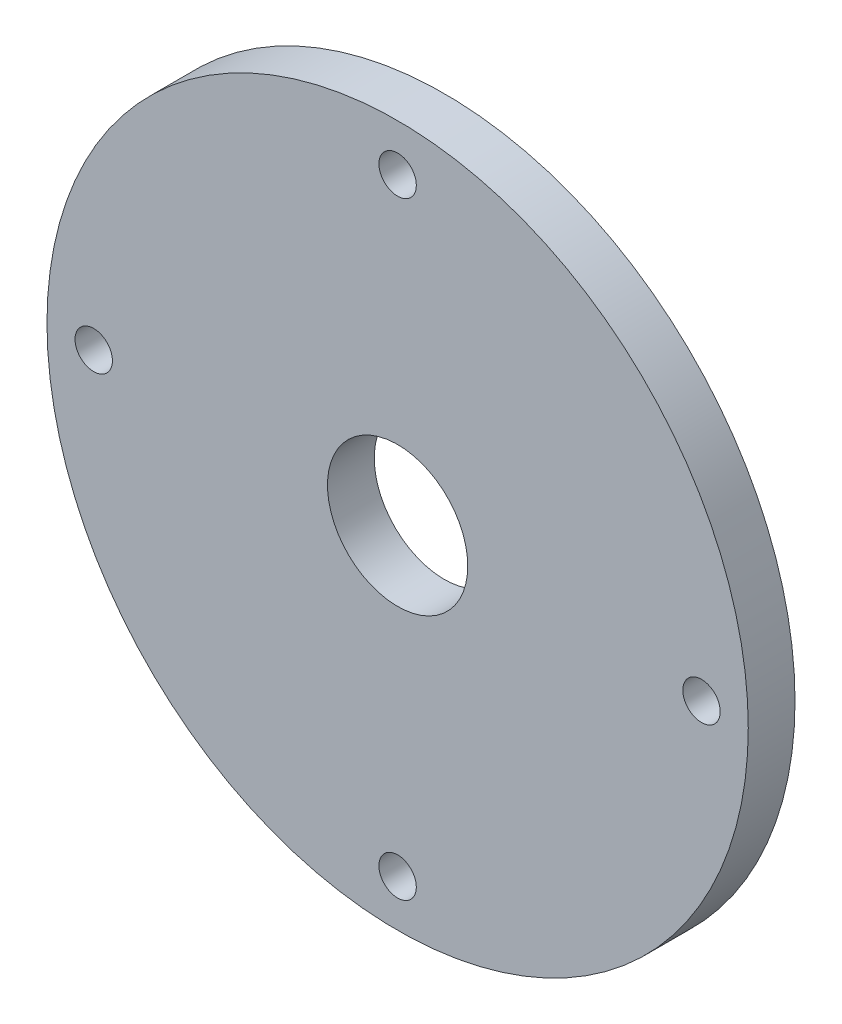
ISO-10303-21;
HEADER;
FILE_DESCRIPTION(('STEP AP214'),'2;1');
FILE_NAME('part.step','',(''),(''),'','','');
FILE_SCHEMA(('AUTOMOTIVE_DESIGN { 1 0 10303 214 1 1 1 1 }'));
ENDSEC;
DATA;
#1=APPLICATION_CONTEXT('core data for automotive mechanical design processes');
#2=APPLICATION_PROTOCOL_DEFINITION('international standard','automotive_design',2000,#1);
#3=PRODUCT_CONTEXT('',#1,'mechanical');
#4=PRODUCT('Part','Part','',(#3));
#5=PRODUCT_RELATED_PRODUCT_CATEGORY('part','',(#4));
#6=PRODUCT_DEFINITION_FORMATION('','',#4);
#7=PRODUCT_DEFINITION_CONTEXT('part definition',#1,'design');
#8=PRODUCT_DEFINITION('design','',#6,#7);
#9=PRODUCT_DEFINITION_SHAPE('','',#8);
#10=(LENGTH_UNIT() NAMED_UNIT(*) SI_UNIT(.MILLI.,.METRE.));
#11=(NAMED_UNIT(*) PLANE_ANGLE_UNIT() SI_UNIT($,.RADIAN.));
#12=(NAMED_UNIT(*) SI_UNIT($,.STERADIAN.) SOLID_ANGLE_UNIT());
#13=UNCERTAINTY_MEASURE_WITH_UNIT(LENGTH_MEASURE(1.E-05),#10,'distance_accuracy_value','');
#14=(GEOMETRIC_REPRESENTATION_CONTEXT(3) GLOBAL_UNCERTAINTY_ASSIGNED_CONTEXT((#13)) GLOBAL_UNIT_ASSIGNED_CONTEXT((#10,
#11,#12)) REPRESENTATION_CONTEXT('',''));
#15=CARTESIAN_POINT('',(0.,0.,0.));
#16=DIRECTION('',(0.,0.,1.));
#17=DIRECTION('',(1.,0.,0.));
#18=AXIS2_PLACEMENT_3D('',#15,#16,#17);
#19=CARTESIAN_POINT('',(0.,0.,10.));
#20=DIRECTION('',(0.,0.,1.));
#21=DIRECTION('',(1.,0.,0.));
#22=AXIS2_PLACEMENT_3D('',#19,#20,#21);
#23=PLANE('',#22);
#24=CARTESIAN_POINT('',(0.,-65.,10.));
#25=DIRECTION('',(0.,0.,1.));
#26=DIRECTION('',(1.,0.,0.));
#27=AXIS2_PLACEMENT_3D('',#24,#25,#26);
#28=CIRCLE('',#27,4.);
#29=CARTESIAN_POINT('',(4.,-65.,10.));
#30=VERTEX_POINT('',#29);
#31=EDGE_CURVE('E59',#30,#30,#28,.T.);
#32=ORIENTED_EDGE('',*,*,#31,.F.);
#33=EDGE_LOOP('',(#32));
#34=FACE_BOUND('',#33,.T.);
#35=CARTESIAN_POINT('',(0.,65.,10.));
#36=DIRECTION('',(0.,0.,1.));
#37=DIRECTION('',(1.,0.,0.));
#38=AXIS2_PLACEMENT_3D('',#35,#36,#37);
#39=CIRCLE('',#38,4.);
#40=CARTESIAN_POINT('',(4.,65.,10.));
#41=VERTEX_POINT('',#40);
#42=EDGE_CURVE('E47',#41,#41,#39,.T.);
#43=ORIENTED_EDGE('',*,*,#42,.F.);
#44=EDGE_LOOP('',(#43));
#45=FACE_BOUND('',#44,.T.);
#46=CARTESIAN_POINT('',(0.,0.,10.));
#47=DIRECTION('',(0.,0.,1.));
#48=DIRECTION('',(1.,0.,0.));
#49=AXIS2_PLACEMENT_3D('',#46,#47,#48);
#50=CIRCLE('',#49,75.);
#51=CARTESIAN_POINT('',(75.,0.,10.));
#52=VERTEX_POINT('',#51);
#53=EDGE_CURVE('E10',#52,#52,#50,.T.);
#54=ORIENTED_EDGE('',*,*,#53,.T.);
#55=EDGE_LOOP('',(#54));
#56=FACE_BOUND('',#55,.T.);
#57=CARTESIAN_POINT('',(0.,0.,10.));
#58=DIRECTION('',(0.,0.,1.));
#59=DIRECTION('',(1.,0.,0.));
#60=AXIS2_PLACEMENT_3D('',#57,#58,#59);
#61=CIRCLE('',#60,15.);
#62=CARTESIAN_POINT('',(15.,0.,10.));
#63=VERTEX_POINT('',#62);
#64=EDGE_CURVE('E42',#63,#63,#61,.T.);
#65=ORIENTED_EDGE('',*,*,#64,.F.);
#66=EDGE_LOOP('',(#65));
#67=FACE_BOUND('',#66,.T.);
#68=CARTESIAN_POINT('',(-65.,0.,10.));
#69=DIRECTION('',(0.,0.,1.));
#70=DIRECTION('',(1.,0.,0.));
#71=AXIS2_PLACEMENT_3D('',#68,#69,#70);
#72=CIRCLE('',#71,4.00000000000001);
#73=CARTESIAN_POINT('',(-61.,0.,10.));
#74=VERTEX_POINT('',#73);
#75=EDGE_CURVE('E53',#74,#74,#72,.T.);
#76=ORIENTED_EDGE('',*,*,#75,.F.);
#77=EDGE_LOOP('',(#76));
#78=FACE_BOUND('',#77,.T.);
#79=CARTESIAN_POINT('',(65.,0.,10.));
#80=DIRECTION('',(0.,0.,1.));
#81=DIRECTION('',(1.,0.,0.));
#82=AXIS2_PLACEMENT_3D('',#79,#80,#81);
#83=CIRCLE('',#82,4.00000000000001);
#84=CARTESIAN_POINT('',(69.,0.,10.));
#85=VERTEX_POINT('',#84);
#86=EDGE_CURVE('E65',#85,#85,#83,.T.);
#87=ORIENTED_EDGE('',*,*,#86,.F.);
#88=EDGE_LOOP('',(#87));
#89=FACE_BOUND('',#88,.T.);
#90=ADVANCED_FACE('F31',(#34,#45,#56,#67,#78,#89),#23,.T.);
#91=CARTESIAN_POINT('',(0.,0.,0.));
#92=DIRECTION('',(0.,0.,1.));
#93=DIRECTION('',(1.,0.,0.));
#94=AXIS2_PLACEMENT_3D('',#91,#92,#93);
#95=PLANE('',#94);
#96=CARTESIAN_POINT('',(0.,0.,0.));
#97=DIRECTION('',(0.,0.,1.));
#98=DIRECTION('',(1.,0.,0.));
#99=AXIS2_PLACEMENT_3D('',#96,#97,#98);
#100=CIRCLE('',#99,75.);
#101=CARTESIAN_POINT('',(75.,0.,0.));
#102=VERTEX_POINT('',#101);
#103=EDGE_CURVE('E35',#102,#102,#100,.T.);
#104=ORIENTED_EDGE('',*,*,#103,.F.);
#105=EDGE_LOOP('',(#104));
#106=FACE_BOUND('',#105,.T.);
#107=CARTESIAN_POINT('',(0.,0.,0.));
#108=DIRECTION('',(0.,0.,1.));
#109=DIRECTION('',(1.,0.,0.));
#110=AXIS2_PLACEMENT_3D('',#107,#108,#109);
#111=CIRCLE('',#110,15.);
#112=CARTESIAN_POINT('',(15.,0.,0.));
#113=VERTEX_POINT('',#112);
#114=EDGE_CURVE('E44',#113,#113,#111,.T.);
#115=ORIENTED_EDGE('',*,*,#114,.T.);
#116=EDGE_LOOP('',(#115));
#117=FACE_BOUND('',#116,.T.);
#118=CARTESIAN_POINT('',(0.,65.,0.));
#119=DIRECTION('',(0.,0.,1.));
#120=DIRECTION('',(1.,0.,0.));
#121=AXIS2_PLACEMENT_3D('',#118,#119,#120);
#122=CIRCLE('',#121,4.);
#123=CARTESIAN_POINT('',(4.,65.,0.));
#124=VERTEX_POINT('',#123);
#125=EDGE_CURVE('E50',#124,#124,#122,.T.);
#126=ORIENTED_EDGE('',*,*,#125,.T.);
#127=EDGE_LOOP('',(#126));
#128=FACE_BOUND('',#127,.T.);
#129=CARTESIAN_POINT('',(-65.,0.,0.));
#130=DIRECTION('',(0.,0.,1.));
#131=DIRECTION('',(1.,0.,0.));
#132=AXIS2_PLACEMENT_3D('',#129,#130,#131);
#133=CIRCLE('',#132,4.00000000000001);
#134=CARTESIAN_POINT('',(-61.,0.,0.));
#135=VERTEX_POINT('',#134);
#136=EDGE_CURVE('E56',#135,#135,#133,.T.);
#137=ORIENTED_EDGE('',*,*,#136,.T.);
#138=EDGE_LOOP('',(#137));
#139=FACE_BOUND('',#138,.T.);
#140=CARTESIAN_POINT('',(0.,-65.,0.));
#141=DIRECTION('',(0.,0.,1.));
#142=DIRECTION('',(1.,0.,0.));
#143=AXIS2_PLACEMENT_3D('',#140,#141,#142);
#144=CIRCLE('',#143,4.);
#145=CARTESIAN_POINT('',(4.,-65.,0.));
#146=VERTEX_POINT('',#145);
#147=EDGE_CURVE('E62',#146,#146,#144,.T.);
#148=ORIENTED_EDGE('',*,*,#147,.T.);
#149=EDGE_LOOP('',(#148));
#150=FACE_BOUND('',#149,.T.);
#151=CARTESIAN_POINT('',(65.,0.,0.));
#152=DIRECTION('',(0.,0.,1.));
#153=DIRECTION('',(1.,0.,0.));
#154=AXIS2_PLACEMENT_3D('',#151,#152,#153);
#155=CIRCLE('',#154,4.00000000000001);
#156=CARTESIAN_POINT('',(69.,0.,0.));
#157=VERTEX_POINT('',#156);
#158=EDGE_CURVE('E68',#157,#157,#155,.T.);
#159=ORIENTED_EDGE('',*,*,#158,.T.);
#160=EDGE_LOOP('',(#159));
#161=FACE_BOUND('',#160,.T.);
#162=ADVANCED_FACE('F78',(#106,#117,#128,#139,#150,#161),#95,.F.);
#163=CARTESIAN_POINT('',(0.,0.,10.));
#164=DIRECTION('',(0.,0.,-1.));
#165=DIRECTION('',(-1.,0.,0.));
#166=AXIS2_PLACEMENT_3D('',#163,#164,#165);
#167=CYLINDRICAL_SURFACE('',#166,75.);
#168=ORIENTED_EDGE('',*,*,#53,.F.);
#169=EDGE_LOOP('',(#168));
#170=FACE_BOUND('',#169,.T.);
#171=ORIENTED_EDGE('',*,*,#103,.T.);
#172=EDGE_LOOP('',(#171));
#173=FACE_BOUND('',#172,.T.);
#174=ADVANCED_FACE('F33',(#170,#173),#167,.T.);
#175=CARTESIAN_POINT('',(0.,0.,10.));
#176=DIRECTION('',(0.,0.,-1.));
#177=DIRECTION('',(-1.,0.,0.));
#178=AXIS2_PLACEMENT_3D('',#175,#176,#177);
#179=CYLINDRICAL_SURFACE('',#178,15.);
#180=ORIENTED_EDGE('',*,*,#64,.T.);
#181=EDGE_LOOP('',(#180));
#182=FACE_BOUND('',#181,.T.);
#183=ORIENTED_EDGE('',*,*,#114,.F.);
#184=EDGE_LOOP('',(#183));
#185=FACE_BOUND('',#184,.T.);
#186=ADVANCED_FACE('F88',(#182,#185),#179,.F.);
#187=CARTESIAN_POINT('',(0.,65.,10.));
#188=DIRECTION('',(0.,0.,-1.));
#189=DIRECTION('',(-1.,0.,0.));
#190=AXIS2_PLACEMENT_3D('',#187,#188,#189);
#191=CYLINDRICAL_SURFACE('',#190,4.);
#192=ORIENTED_EDGE('',*,*,#42,.T.);
#193=EDGE_LOOP('',(#192));
#194=FACE_BOUND('',#193,.T.);
#195=ORIENTED_EDGE('',*,*,#125,.F.);
#196=EDGE_LOOP('',(#195));
#197=FACE_BOUND('',#196,.T.);
#198=ADVANCED_FACE('F91',(#194,#197),#191,.F.);
#199=CARTESIAN_POINT('',(-65.,0.,10.));
#200=DIRECTION('',(0.,0.,-1.));
#201=DIRECTION('',(-1.,0.,0.));
#202=AXIS2_PLACEMENT_3D('',#199,#200,#201);
#203=CYLINDRICAL_SURFACE('',#202,4.00000000000001);
#204=ORIENTED_EDGE('',*,*,#75,.T.);
#205=EDGE_LOOP('',(#204));
#206=FACE_BOUND('',#205,.T.);
#207=ORIENTED_EDGE('',*,*,#136,.F.);
#208=EDGE_LOOP('',(#207));
#209=FACE_BOUND('',#208,.T.);
#210=ADVANCED_FACE('F95',(#206,#209),#203,.F.);
#211=CARTESIAN_POINT('',(0.,-65.,10.));
#212=DIRECTION('',(0.,0.,-1.));
#213=DIRECTION('',(-1.,0.,0.));
#214=AXIS2_PLACEMENT_3D('',#211,#212,#213);
#215=CYLINDRICAL_SURFACE('',#214,4.);
#216=ORIENTED_EDGE('',*,*,#31,.T.);
#217=EDGE_LOOP('',(#216));
#218=FACE_BOUND('',#217,.T.);
#219=ORIENTED_EDGE('',*,*,#147,.F.);
#220=EDGE_LOOP('',(#219));
#221=FACE_BOUND('',#220,.T.);
#222=ADVANCED_FACE('F99',(#218,#221),#215,.F.);
#223=CARTESIAN_POINT('',(65.,0.,10.));
#224=DIRECTION('',(0.,0.,-1.));
#225=DIRECTION('',(-1.,0.,0.));
#226=AXIS2_PLACEMENT_3D('',#223,#224,#225);
#227=CYLINDRICAL_SURFACE('',#226,4.00000000000001);
#228=ORIENTED_EDGE('',*,*,#86,.T.);
#229=EDGE_LOOP('',(#228));
#230=FACE_BOUND('',#229,.T.);
#231=ORIENTED_EDGE('',*,*,#158,.F.);
#232=EDGE_LOOP('',(#231));
#233=FACE_BOUND('',#232,.T.);
#234=ADVANCED_FACE('F74',(#230,#233),#227,.F.);
#235=CLOSED_SHELL('',(#90,#162,#174,#186,#198,#210,#222,#234));
#236=MANIFOLD_SOLID_BREP('B2',#235);
#237=ADVANCED_BREP_SHAPE_REPRESENTATION('',(#18,#236),#14);
#238=SHAPE_DEFINITION_REPRESENTATION(#9,#237);
ENDSEC;
END-ISO-10303-21;
